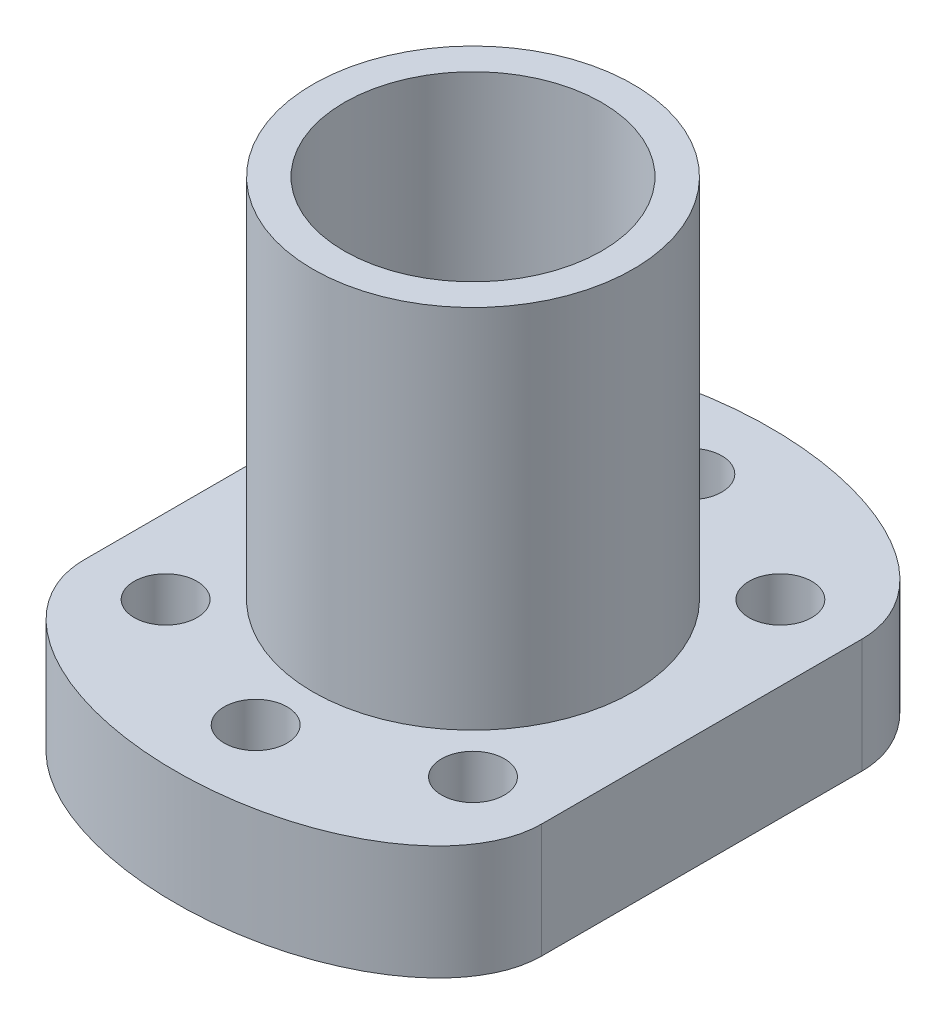
ISO-10303-21;
HEADER;
FILE_DESCRIPTION(('STEP AP214'),'2;1');
FILE_NAME('part.step','',(''),(''),'','','');
FILE_SCHEMA(('AUTOMOTIVE_DESIGN { 1 0 10303 214 1 1 1 1 }'));
ENDSEC;
DATA;
#1=APPLICATION_CONTEXT('core data for automotive mechanical design processes');
#2=APPLICATION_PROTOCOL_DEFINITION('international standard','automotive_design',2000,#1);
#3=PRODUCT_CONTEXT('',#1,'mechanical');
#4=PRODUCT('Part','Part','',(#3));
#5=PRODUCT_RELATED_PRODUCT_CATEGORY('part','',(#4));
#6=PRODUCT_DEFINITION_FORMATION('','',#4);
#7=PRODUCT_DEFINITION_CONTEXT('part definition',#1,'design');
#8=PRODUCT_DEFINITION('design','',#6,#7);
#9=PRODUCT_DEFINITION_SHAPE('','',#8);
#10=(LENGTH_UNIT() NAMED_UNIT(*) SI_UNIT(.MILLI.,.METRE.));
#11=(NAMED_UNIT(*) PLANE_ANGLE_UNIT() SI_UNIT($,.RADIAN.));
#12=(NAMED_UNIT(*) SI_UNIT($,.STERADIAN.) SOLID_ANGLE_UNIT());
#13=UNCERTAINTY_MEASURE_WITH_UNIT(LENGTH_MEASURE(1.E-05),#10,'distance_accuracy_value','');
#14=(GEOMETRIC_REPRESENTATION_CONTEXT(3) GLOBAL_UNCERTAINTY_ASSIGNED_CONTEXT((#13)) GLOBAL_UNIT_ASSIGNED_CONTEXT((#10,
#11,#12)) REPRESENTATION_CONTEXT('',''));
#15=CARTESIAN_POINT('',(0.,0.,0.));
#16=DIRECTION('',(0.,0.,1.));
#17=DIRECTION('',(1.,0.,0.));
#18=AXIS2_PLACEMENT_3D('',#15,#16,#17);
#19=CARTESIAN_POINT('',(0.,10.,-40.));
#20=DIRECTION('',(1.,0.,0.));
#21=DIRECTION('',(0.,0.,-1.));
#22=AXIS2_PLACEMENT_3D('',#19,#20,#21);
#23=PLANE('',#22);
#24=DIRECTION('',(0.,0.,1.));
#25=VECTOR('',#24,1.);
#26=CARTESIAN_POINT('',(0.,0.,-40.));
#27=LINE('',#26,#25);
#28=CARTESIAN_POINT('',(0.,0.,-40.));
#29=VERTEX_POINT('',#28);
#30=CARTESIAN_POINT('',(0.,0.,-12.));
#31=VERTEX_POINT('',#30);
#32=EDGE_CURVE('E117',#29,#31,#27,.T.);
#33=ORIENTED_EDGE('',*,*,#32,.T.);
#34=DIRECTION('',(0.,-1.,0.));
#35=VECTOR('',#34,1.);
#36=CARTESIAN_POINT('',(0.,10.,-12.));
#37=LINE('',#36,#35);
#38=CARTESIAN_POINT('',(0.,10.,-12.));
#39=VERTEX_POINT('',#38);
#40=EDGE_CURVE('E47',#39,#31,#37,.T.);
#41=ORIENTED_EDGE('',*,*,#40,.F.);
#42=DIRECTION('',(0.,0.,1.));
#43=VECTOR('',#42,1.);
#44=CARTESIAN_POINT('',(0.,10.,-40.));
#45=LINE('',#44,#43);
#46=CARTESIAN_POINT('',(0.,10.,-40.));
#47=VERTEX_POINT('',#46);
#48=EDGE_CURVE('E87',#47,#39,#45,.T.);
#49=ORIENTED_EDGE('',*,*,#48,.F.);
#50=DIRECTION('',(0.,-1.,0.));
#51=VECTOR('',#50,1.);
#52=CARTESIAN_POINT('',(0.,10.,-40.));
#53=LINE('',#52,#51);
#54=EDGE_CURVE('E62',#47,#29,#53,.T.);
#55=ORIENTED_EDGE('',*,*,#54,.T.);
#56=EDGE_LOOP('',(#33,#41,#49,#55));
#57=FACE_BOUND('',#56,.T.);
#58=ADVANCED_FACE('F44',(#57),#23,.F.);
#59=CARTESIAN_POINT('',(20.,10.,-12.));
#60=DIRECTION('',(0.,-1.,0.));
#61=DIRECTION('',(1.,0.,0.));
#62=AXIS2_PLACEMENT_3D('',#59,#60,#61);
#63=ELLIPSE('',#62,20.,12.);
#64=DIRECTION('',(0.,-1.,0.));
#65=VECTOR('',#64,1.);
#66=SURFACE_OF_LINEAR_EXTRUSION('',#63,#65);
#67=CARTESIAN_POINT('',(20.,0.,-12.));
#68=DIRECTION('',(0.,-1.,0.));
#69=DIRECTION('',(1.,0.,0.));
#70=AXIS2_PLACEMENT_3D('',#67,#68,#69);
#71=ELLIPSE('',#70,20.,12.);
#72=CARTESIAN_POINT('',(40.,0.,-12.));
#73=VERTEX_POINT('',#72);
#74=EDGE_CURVE('E97',#73,#31,#71,.T.);
#75=ORIENTED_EDGE('',*,*,#74,.F.);
#76=DIRECTION('',(0.,-1.,0.));
#77=VECTOR('',#76,1.);
#78=CARTESIAN_POINT('',(40.,10.,-12.));
#79=LINE('',#78,#77);
#80=CARTESIAN_POINT('',(40.,10.,-12.));
#81=VERTEX_POINT('',#80);
#82=EDGE_CURVE('E93',#81,#73,#79,.T.);
#83=ORIENTED_EDGE('',*,*,#82,.F.);
#84=EDGE_CURVE('E95',#81,#39,#63,.T.);
#85=ORIENTED_EDGE('',*,*,#84,.T.);
#86=ORIENTED_EDGE('',*,*,#40,.T.);
#87=EDGE_LOOP('',(#75,#83,#85,#86));
#88=FACE_BOUND('',#87,.T.);
#89=ADVANCED_FACE('F94',(#88),#66,.T.);
#90=CARTESIAN_POINT('',(40.,10.,-40.));
#91=DIRECTION('',(1.,0.,0.));
#92=DIRECTION('',(0.,0.,-1.));
#93=AXIS2_PLACEMENT_3D('',#90,#91,#92);
#94=PLANE('',#93);
#95=DIRECTION('',(0.,0.,1.));
#96=VECTOR('',#95,1.);
#97=CARTESIAN_POINT('',(40.,0.,-40.));
#98=LINE('',#97,#96);
#99=CARTESIAN_POINT('',(40.,0.,-40.));
#100=VERTEX_POINT('',#99);
#101=EDGE_CURVE('E137',#100,#73,#98,.T.);
#102=ORIENTED_EDGE('',*,*,#101,.F.);
#103=DIRECTION('',(0.,-1.,0.));
#104=VECTOR('',#103,1.);
#105=CARTESIAN_POINT('',(40.,10.,-40.));
#106=LINE('',#105,#104);
#107=CARTESIAN_POINT('',(40.,10.,-40.));
#108=VERTEX_POINT('',#107);
#109=EDGE_CURVE('E76',#108,#100,#106,.T.);
#110=ORIENTED_EDGE('',*,*,#109,.F.);
#111=DIRECTION('',(0.,0.,1.));
#112=VECTOR('',#111,1.);
#113=CARTESIAN_POINT('',(40.,10.,-40.));
#114=LINE('',#113,#112);
#115=EDGE_CURVE('E104',#108,#81,#114,.T.);
#116=ORIENTED_EDGE('',*,*,#115,.T.);
#117=ORIENTED_EDGE('',*,*,#82,.T.);
#118=EDGE_LOOP('',(#102,#110,#116,#117));
#119=FACE_BOUND('',#118,.T.);
#120=ADVANCED_FACE('F107',(#119),#94,.T.);
#121=CARTESIAN_POINT('',(20.,10.,-40.));
#122=DIRECTION('',(0.,-1.,0.));
#123=DIRECTION('',(-1.,0.,0.));
#124=AXIS2_PLACEMENT_3D('',#121,#122,#123);
#125=ELLIPSE('',#124,20.,12.);
#126=DIRECTION('',(0.,-1.,0.));
#127=VECTOR('',#126,1.);
#128=SURFACE_OF_LINEAR_EXTRUSION('',#125,#127);
#129=CARTESIAN_POINT('',(20.,0.,-40.));
#130=DIRECTION('',(0.,-1.,0.));
#131=DIRECTION('',(-1.,0.,0.));
#132=AXIS2_PLACEMENT_3D('',#129,#130,#131);
#133=ELLIPSE('',#132,20.,12.);
#134=EDGE_CURVE('E140',#29,#100,#133,.T.);
#135=ORIENTED_EDGE('',*,*,#134,.F.);
#136=ORIENTED_EDGE('',*,*,#54,.F.);
#137=EDGE_CURVE('E109',#47,#108,#125,.T.);
#138=ORIENTED_EDGE('',*,*,#137,.T.);
#139=ORIENTED_EDGE('',*,*,#109,.T.);
#140=EDGE_LOOP('',(#135,#136,#138,#139));
#141=FACE_BOUND('',#140,.T.);
#142=ADVANCED_FACE('F120',(#141),#128,.T.);
#143=CARTESIAN_POINT('',(20.,10.,-12.));
#144=DIRECTION('',(0.,-1.,0.));
#145=DIRECTION('',(0.,0.,-1.));
#146=AXIS2_PLACEMENT_3D('',#143,#144,#145);
#147=PLANE('',#146);
#148=CARTESIAN_POINT('',(20.,10.,-45.));
#149=DIRECTION('',(0.,1.,0.));
#150=DIRECTION('',(0.,0.,1.));
#151=AXIS2_PLACEMENT_3D('',#148,#149,#150);
#152=CIRCLE('',#151,2.75);
#153=CARTESIAN_POINT('',(20.,10.,-42.25));
#154=VERTEX_POINT('',#153);
#155=EDGE_CURVE('E196',#154,#154,#152,.T.);
#156=ORIENTED_EDGE('',*,*,#155,.F.);
#157=EDGE_LOOP('',(#156));
#158=FACE_BOUND('',#157,.T.);
#159=CARTESIAN_POINT('',(6.56497115745578,10.,-12.5649711574556));
#160=DIRECTION('',(0.,1.,0.));
#161=DIRECTION('',(0.,0.,1.));
#162=AXIS2_PLACEMENT_3D('',#159,#160,#161);
#163=CIRCLE('',#162,2.75);
#164=CARTESIAN_POINT('',(6.56497115745578,10.,-9.81497115745562));
#165=VERTEX_POINT('',#164);
#166=EDGE_CURVE('E168',#165,#165,#163,.T.);
#167=ORIENTED_EDGE('',*,*,#166,.F.);
#168=EDGE_LOOP('',(#167));
#169=FACE_BOUND('',#168,.T.);
#170=CARTESIAN_POINT('',(33.4350288425424,10.,-12.5649711574534));
#171=DIRECTION('',(0.,1.,0.));
#172=DIRECTION('',(0.,0.,1.));
#173=AXIS2_PLACEMENT_3D('',#170,#171,#172);
#174=CIRCLE('',#173,2.75);
#175=CARTESIAN_POINT('',(33.4350288425424,10.,-9.81497115745337));
#176=VERTEX_POINT('',#175);
#177=EDGE_CURVE('E167',#176,#176,#174,.T.);
#178=ORIENTED_EDGE('',*,*,#177,.F.);
#179=EDGE_LOOP('',(#178));
#180=FACE_BOUND('',#179,.T.);
#181=CARTESIAN_POINT('',(20.0000000000002,10.,-7.0000000000002));
#182=DIRECTION('',(0.,1.,0.));
#183=DIRECTION('',(0.,0.,1.));
#184=AXIS2_PLACEMENT_3D('',#181,#182,#183);
#185=CIRCLE('',#184,2.75);
#186=CARTESIAN_POINT('',(20.0000000000002,10.,-4.25000000000021));
#187=VERTEX_POINT('',#186);
#188=EDGE_CURVE('E176',#187,#187,#185,.T.);
#189=ORIENTED_EDGE('',*,*,#188,.F.);
#190=EDGE_LOOP('',(#189));
#191=FACE_BOUND('',#190,.T.);
#192=CARTESIAN_POINT('',(6.56497115745392,10.,-39.4350288425422));
#193=DIRECTION('',(0.,1.,0.));
#194=DIRECTION('',(0.,0.,1.));
#195=AXIS2_PLACEMENT_3D('',#192,#193,#194);
#196=CIRCLE('',#195,2.75);
#197=CARTESIAN_POINT('',(6.56497115745392,10.,-36.6850288425422));
#198=VERTEX_POINT('',#197);
#199=EDGE_CURVE('E184',#198,#198,#196,.T.);
#200=ORIENTED_EDGE('',*,*,#199,.F.);
#201=EDGE_LOOP('',(#200));
#202=FACE_BOUND('',#201,.T.);
#203=CARTESIAN_POINT('',(33.4350288425445,10.,-39.4350288425445));
#204=DIRECTION('',(0.,1.,0.));
#205=DIRECTION('',(0.,0.,1.));
#206=AXIS2_PLACEMENT_3D('',#203,#204,#205);
#207=CIRCLE('',#206,2.75);
#208=CARTESIAN_POINT('',(33.4350288425445,10.,-36.6850288425445));
#209=VERTEX_POINT('',#208);
#210=EDGE_CURVE('E192',#209,#209,#207,.T.);
#211=ORIENTED_EDGE('',*,*,#210,.F.);
#212=EDGE_LOOP('',(#211));
#213=FACE_BOUND('',#212,.T.);
#214=CARTESIAN_POINT('',(20.,10.,-26.));
#215=DIRECTION('',(0.,1.,0.));
#216=DIRECTION('',(0.,0.,1.));
#217=AXIS2_PLACEMENT_3D('',#214,#215,#216);
#218=CIRCLE('',#217,14.);
#219=CARTESIAN_POINT('',(20.,10.,-12.));
#220=VERTEX_POINT('',#219);
#221=EDGE_CURVE('E11',#220,#220,#218,.T.);
#222=ORIENTED_EDGE('',*,*,#221,.F.);
#223=EDGE_LOOP('',(#222));
#224=FACE_BOUND('',#223,.T.);
#225=ORIENTED_EDGE('',*,*,#48,.T.);
#226=ORIENTED_EDGE('',*,*,#84,.F.);
#227=ORIENTED_EDGE('',*,*,#115,.F.);
#228=ORIENTED_EDGE('',*,*,#137,.F.);
#229=EDGE_LOOP('',(#225,#226,#227,#228));
#230=FACE_BOUND('',#229,.T.);
#231=ADVANCED_FACE('F103',(#158,#169,#180,#191,#202,#213,#224,#230),#147,.F.);
#232=CARTESIAN_POINT('',(20.,0.,-12.));
#233=DIRECTION('',(0.,-1.,0.));
#234=DIRECTION('',(0.,0.,-1.));
#235=AXIS2_PLACEMENT_3D('',#232,#233,#234);
#236=PLANE('',#235);
#237=CARTESIAN_POINT('',(20.,0.,-45.));
#238=DIRECTION('',(0.,1.,0.));
#239=DIRECTION('',(0.,0.,1.));
#240=AXIS2_PLACEMENT_3D('',#237,#238,#239);
#241=CIRCLE('',#240,2.75);
#242=CARTESIAN_POINT('',(20.,0.,-42.25));
#243=VERTEX_POINT('',#242);
#244=EDGE_CURVE('E159',#243,#243,#241,.T.);
#245=ORIENTED_EDGE('',*,*,#244,.T.);
#246=EDGE_LOOP('',(#245));
#247=FACE_BOUND('',#246,.T.);
#248=CARTESIAN_POINT('',(6.56497115745578,0.,-12.5649711574556));
#249=DIRECTION('',(0.,1.,0.));
#250=DIRECTION('',(0.,0.,1.));
#251=AXIS2_PLACEMENT_3D('',#248,#249,#250);
#252=CIRCLE('',#251,2.75);
#253=CARTESIAN_POINT('',(6.56497115745578,0.,-9.81497115745562));
#254=VERTEX_POINT('',#253);
#255=EDGE_CURVE('E197',#254,#254,#252,.T.);
#256=ORIENTED_EDGE('',*,*,#255,.T.);
#257=EDGE_LOOP('',(#256));
#258=FACE_BOUND('',#257,.T.);
#259=CARTESIAN_POINT('',(33.4350288425424,0.,-12.5649711574534));
#260=DIRECTION('',(0.,1.,0.));
#261=DIRECTION('',(0.,0.,1.));
#262=AXIS2_PLACEMENT_3D('',#259,#260,#261);
#263=CIRCLE('',#262,2.75);
#264=CARTESIAN_POINT('',(33.4350288425424,0.,-9.81497115745337));
#265=VERTEX_POINT('',#264);
#266=EDGE_CURVE('E163',#265,#265,#263,.T.);
#267=ORIENTED_EDGE('',*,*,#266,.T.);
#268=EDGE_LOOP('',(#267));
#269=FACE_BOUND('',#268,.T.);
#270=CARTESIAN_POINT('',(20.0000000000002,0.,-7.0000000000002));
#271=DIRECTION('',(0.,1.,0.));
#272=DIRECTION('',(0.,0.,1.));
#273=AXIS2_PLACEMENT_3D('',#270,#271,#272);
#274=CIRCLE('',#273,2.75);
#275=CARTESIAN_POINT('',(20.0000000000002,0.,-4.25000000000021));
#276=VERTEX_POINT('',#275);
#277=EDGE_CURVE('E172',#276,#276,#274,.T.);
#278=ORIENTED_EDGE('',*,*,#277,.T.);
#279=EDGE_LOOP('',(#278));
#280=FACE_BOUND('',#279,.T.);
#281=CARTESIAN_POINT('',(6.56497115745392,0.,-39.4350288425422));
#282=DIRECTION('',(0.,1.,0.));
#283=DIRECTION('',(0.,0.,1.));
#284=AXIS2_PLACEMENT_3D('',#281,#282,#283);
#285=CIRCLE('',#284,2.75);
#286=CARTESIAN_POINT('',(6.56497115745392,0.,-36.6850288425422));
#287=VERTEX_POINT('',#286);
#288=EDGE_CURVE('E180',#287,#287,#285,.T.);
#289=ORIENTED_EDGE('',*,*,#288,.T.);
#290=EDGE_LOOP('',(#289));
#291=FACE_BOUND('',#290,.T.);
#292=CARTESIAN_POINT('',(33.4350288425445,0.,-39.4350288425445));
#293=DIRECTION('',(0.,1.,0.));
#294=DIRECTION('',(0.,0.,1.));
#295=AXIS2_PLACEMENT_3D('',#292,#293,#294);
#296=CIRCLE('',#295,2.75);
#297=CARTESIAN_POINT('',(33.4350288425445,0.,-36.6850288425445));
#298=VERTEX_POINT('',#297);
#299=EDGE_CURVE('E188',#298,#298,#296,.T.);
#300=ORIENTED_EDGE('',*,*,#299,.T.);
#301=EDGE_LOOP('',(#300));
#302=FACE_BOUND('',#301,.T.);
#303=CARTESIAN_POINT('',(20.,0.,-26.));
#304=DIRECTION('',(0.,1.,0.));
#305=DIRECTION('',(0.,0.,1.));
#306=AXIS2_PLACEMENT_3D('',#303,#304,#305);
#307=CIRCLE('',#306,11.25);
#308=CARTESIAN_POINT('',(20.,0.,-14.75));
#309=VERTEX_POINT('',#308);
#310=EDGE_CURVE('E154',#309,#309,#307,.T.);
#311=ORIENTED_EDGE('',*,*,#310,.T.);
#312=EDGE_LOOP('',(#311));
#313=FACE_BOUND('',#312,.T.);
#314=ORIENTED_EDGE('',*,*,#32,.F.);
#315=ORIENTED_EDGE('',*,*,#134,.T.);
#316=ORIENTED_EDGE('',*,*,#101,.T.);
#317=ORIENTED_EDGE('',*,*,#74,.T.);
#318=EDGE_LOOP('',(#314,#315,#316,#317));
#319=FACE_BOUND('',#318,.T.);
#320=ADVANCED_FACE('F124',(#247,#258,#269,#280,#291,#302,#313,#319),#236,.T.);
#321=CARTESIAN_POINT('',(20.,42.,-26.));
#322=DIRECTION('',(0.,-1.,0.));
#323=DIRECTION('',(0.,0.,-1.));
#324=AXIS2_PLACEMENT_3D('',#321,#322,#323);
#325=CYLINDRICAL_SURFACE('',#324,14.);
#326=CARTESIAN_POINT('',(20.,42.,-26.));
#327=DIRECTION('',(0.,1.,0.));
#328=DIRECTION('',(0.,0.,1.));
#329=AXIS2_PLACEMENT_3D('',#326,#327,#328);
#330=CIRCLE('',#329,14.);
#331=CARTESIAN_POINT('',(20.,42.,-12.));
#332=VERTEX_POINT('',#331);
#333=EDGE_CURVE('E136',#332,#332,#330,.T.);
#334=ORIENTED_EDGE('',*,*,#333,.F.);
#335=EDGE_LOOP('',(#334));
#336=FACE_BOUND('',#335,.T.);
#337=ORIENTED_EDGE('',*,*,#221,.T.);
#338=EDGE_LOOP('',(#337));
#339=FACE_BOUND('',#338,.T.);
#340=ADVANCED_FACE('F234',(#336,#339),#325,.T.);
#341=CARTESIAN_POINT('',(20.,42.,-26.));
#342=DIRECTION('',(0.,1.,0.));
#343=DIRECTION('',(0.,0.,1.));
#344=AXIS2_PLACEMENT_3D('',#341,#342,#343);
#345=PLANE('',#344);
#346=CARTESIAN_POINT('',(20.,42.,-26.));
#347=DIRECTION('',(0.,1.,0.));
#348=DIRECTION('',(0.,0.,1.));
#349=AXIS2_PLACEMENT_3D('',#346,#347,#348);
#350=CIRCLE('',#349,11.25);
#351=CARTESIAN_POINT('',(20.,42.,-14.75));
#352=VERTEX_POINT('',#351);
#353=EDGE_CURVE('E155',#352,#352,#350,.T.);
#354=ORIENTED_EDGE('',*,*,#353,.F.);
#355=EDGE_LOOP('',(#354));
#356=FACE_BOUND('',#355,.T.);
#357=ORIENTED_EDGE('',*,*,#333,.T.);
#358=EDGE_LOOP('',(#357));
#359=FACE_BOUND('',#358,.T.);
#360=ADVANCED_FACE('F236',(#356,#359),#345,.T.);
#361=CARTESIAN_POINT('',(20.,0.,-26.));
#362=DIRECTION('',(0.,1.,0.));
#363=DIRECTION('',(0.,0.,1.));
#364=AXIS2_PLACEMENT_3D('',#361,#362,#363);
#365=CYLINDRICAL_SURFACE('',#364,11.25);
#366=CARTESIAN_POINT('',(20.,0.,-14.75));
#367=CARTESIAN_POINT('',(20.,0.437499999999999,-14.75));
#368=CARTESIAN_POINT('',(20.,0.875,-14.75));
#369=CARTESIAN_POINT('',(20.,1.75,-14.75));
#370=CARTESIAN_POINT('',(20.,2.1875,-14.75));
#371=CARTESIAN_POINT('',(20.,3.0625,-14.75));
#372=CARTESIAN_POINT('',(20.,3.5,-14.75));
#373=CARTESIAN_POINT('',(20.,4.375,-14.75));
#374=CARTESIAN_POINT('',(20.,4.8125,-14.75));
#375=CARTESIAN_POINT('',(20.,5.6875,-14.75));
#376=CARTESIAN_POINT('',(20.,6.125,-14.75));
#377=CARTESIAN_POINT('',(20.,7.,-14.75));
#378=CARTESIAN_POINT('',(20.,7.4375,-14.75));
#379=CARTESIAN_POINT('',(20.,8.3125,-14.75));
#380=CARTESIAN_POINT('',(20.,8.75,-14.75));
#381=CARTESIAN_POINT('',(20.,9.625,-14.75));
#382=CARTESIAN_POINT('',(20.,10.0625,-14.75));
#383=CARTESIAN_POINT('',(20.,10.9375,-14.75));
#384=CARTESIAN_POINT('',(20.,11.375,-14.75));
#385=CARTESIAN_POINT('',(20.,12.25,-14.75));
#386=CARTESIAN_POINT('',(20.,12.6875,-14.75));
#387=CARTESIAN_POINT('',(20.,13.5625,-14.75));
#388=CARTESIAN_POINT('',(20.,14.,-14.75));
#389=CARTESIAN_POINT('',(20.,14.875,-14.75));
#390=CARTESIAN_POINT('',(20.,15.3125,-14.75));
#391=CARTESIAN_POINT('',(20.,16.1875,-14.75));
#392=CARTESIAN_POINT('',(20.,16.625,-14.75));
#393=CARTESIAN_POINT('',(20.,17.5,-14.75));
#394=CARTESIAN_POINT('',(20.,17.9375,-14.75));
#395=CARTESIAN_POINT('',(20.,18.8125,-14.75));
#396=CARTESIAN_POINT('',(20.,19.25,-14.75));
#397=CARTESIAN_POINT('',(20.,20.125,-14.75));
#398=CARTESIAN_POINT('',(20.,20.5625,-14.75));
#399=CARTESIAN_POINT('',(20.,21.4375,-14.75));
#400=CARTESIAN_POINT('',(20.,21.875,-14.75));
#401=CARTESIAN_POINT('',(20.,22.75,-14.75));
#402=CARTESIAN_POINT('',(20.,23.1875,-14.75));
#403=CARTESIAN_POINT('',(20.,24.0625,-14.75));
#404=CARTESIAN_POINT('',(20.,24.5,-14.75));
#405=CARTESIAN_POINT('',(20.,25.375,-14.75));
#406=CARTESIAN_POINT('',(20.,25.8125,-14.75));
#407=CARTESIAN_POINT('',(20.,26.6875,-14.75));
#408=CARTESIAN_POINT('',(20.,27.125,-14.75));
#409=CARTESIAN_POINT('',(20.,28.,-14.75));
#410=CARTESIAN_POINT('',(20.,28.4375,-14.75));
#411=CARTESIAN_POINT('',(20.,29.3125,-14.75));
#412=CARTESIAN_POINT('',(20.,29.75,-14.75));
#413=CARTESIAN_POINT('',(20.,30.625,-14.75));
#414=CARTESIAN_POINT('',(20.,31.0625,-14.75));
#415=CARTESIAN_POINT('',(20.,31.9375,-14.75));
#416=CARTESIAN_POINT('',(20.,32.375,-14.75));
#417=CARTESIAN_POINT('',(20.,33.25,-14.75));
#418=CARTESIAN_POINT('',(20.,33.6875,-14.75));
#419=CARTESIAN_POINT('',(20.,34.5625,-14.75));
#420=CARTESIAN_POINT('',(20.,35.,-14.75));
#421=CARTESIAN_POINT('',(20.,35.875,-14.75));
#422=CARTESIAN_POINT('',(20.,36.3125,-14.75));
#423=CARTESIAN_POINT('',(20.,37.1875,-14.75));
#424=CARTESIAN_POINT('',(20.,37.625,-14.75));
#425=CARTESIAN_POINT('',(20.,38.5,-14.75));
#426=CARTESIAN_POINT('',(20.,38.9375,-14.75));
#427=CARTESIAN_POINT('',(20.,39.8125,-14.75));
#428=CARTESIAN_POINT('',(20.,40.25,-14.75));
#429=CARTESIAN_POINT('',(20.,41.125,-14.75));
#430=CARTESIAN_POINT('',(20.,41.5625,-14.75));
#431=CARTESIAN_POINT('',(20.,42.,-14.75));
#432=B_SPLINE_CURVE_WITH_KNOTS('',3,(#366,#367,#368,#369,#370,#371,#372,#373,#374,#375,#376,
#377,#378,#379,#380,#381,#382,#383,#384,#385,#386,#387,#388,#389,#390,#391,#392,#393,#394,#395,
#396,#397,#398,#399,#400,#401,#402,#403,#404,#405,#406,#407,#408,#409,#410,#411,#412,#413,#414,
#415,#416,#417,#418,#419,#420,#421,#422,#423,#424,#425,#426,#427,#428,#429,#430,#431),
.UNSPECIFIED.,.F.,.F.,(4,2,2,2,2,2,2,2,2,2,2,2,2,2,2,2,2,2,2,2,2,2,2,2,2,2,2,2,2,2,2,2,4),(0.,
1.3125,2.625,3.9375,5.25,6.5625,7.875,9.1875,10.5,11.8125,13.125,14.4375,15.75,17.0625,18.375,
19.6875,21.,22.3125,23.625,24.9375,26.25,27.5625,28.875,30.1875,31.5,32.8125,34.125,35.4375,
36.75,38.0625,39.375,40.6875,42.),.UNSPECIFIED.);
#433=EDGE_CURVE('BSEAM242',#309,#352,#432,.T.);
#434=ORIENTED_EDGE('',*,*,#310,.F.);
#435=ORIENTED_EDGE('',*,*,#353,.T.);
#436=ORIENTED_EDGE('',*,*,#433,.T.);
#437=ORIENTED_EDGE('',*,*,#433,.F.);
#438=EDGE_LOOP('',(#434,#436,#435,#437));
#439=FACE_BOUND('',#438,.T.);
#440=ADVANCED_FACE('F242',(#439),#365,.F.);
#441=CARTESIAN_POINT('',(33.4350288425445,0.,-39.4350288425445));
#442=DIRECTION('',(0.,1.,0.));
#443=DIRECTION('',(0.,0.,1.));
#444=AXIS2_PLACEMENT_3D('',#441,#442,#443);
#445=CYLINDRICAL_SURFACE('',#444,2.75);
#446=ORIENTED_EDGE('',*,*,#299,.F.);
#447=EDGE_LOOP('',(#446));
#448=FACE_BOUND('',#447,.T.);
#449=ORIENTED_EDGE('',*,*,#210,.T.);
#450=EDGE_LOOP('',(#449));
#451=FACE_BOUND('',#450,.T.);
#452=ADVANCED_FACE('F250',(#448,#451),#445,.F.);
#453=CARTESIAN_POINT('',(6.56497115745392,0.,-39.4350288425422));
#454=DIRECTION('',(0.,1.,0.));
#455=DIRECTION('',(0.,0.,1.));
#456=AXIS2_PLACEMENT_3D('',#453,#454,#455);
#457=CYLINDRICAL_SURFACE('',#456,2.75);
#458=ORIENTED_EDGE('',*,*,#288,.F.);
#459=EDGE_LOOP('',(#458));
#460=FACE_BOUND('',#459,.T.);
#461=ORIENTED_EDGE('',*,*,#199,.T.);
#462=EDGE_LOOP('',(#461));
#463=FACE_BOUND('',#462,.T.);
#464=ADVANCED_FACE('F259',(#460,#463),#457,.F.);
#465=CARTESIAN_POINT('',(20.0000000000002,0.,-7.0000000000002));
#466=DIRECTION('',(0.,1.,0.));
#467=DIRECTION('',(0.,0.,1.));
#468=AXIS2_PLACEMENT_3D('',#465,#466,#467);
#469=CYLINDRICAL_SURFACE('',#468,2.75);
#470=ORIENTED_EDGE('',*,*,#277,.F.);
#471=EDGE_LOOP('',(#470));
#472=FACE_BOUND('',#471,.T.);
#473=ORIENTED_EDGE('',*,*,#188,.T.);
#474=EDGE_LOOP('',(#473));
#475=FACE_BOUND('',#474,.T.);
#476=ADVANCED_FACE('F255',(#472,#475),#469,.F.);
#477=CARTESIAN_POINT('',(33.4350288425424,0.,-12.5649711574534));
#478=DIRECTION('',(0.,1.,0.));
#479=DIRECTION('',(0.,0.,1.));
#480=AXIS2_PLACEMENT_3D('',#477,#478,#479);
#481=CYLINDRICAL_SURFACE('',#480,2.75);
#482=ORIENTED_EDGE('',*,*,#266,.F.);
#483=EDGE_LOOP('',(#482));
#484=FACE_BOUND('',#483,.T.);
#485=ORIENTED_EDGE('',*,*,#177,.T.);
#486=EDGE_LOOP('',(#485));
#487=FACE_BOUND('',#486,.T.);
#488=ADVANCED_FACE('F252',(#484,#487),#481,.F.);
#489=CARTESIAN_POINT('',(6.56497115745578,0.,-12.5649711574556));
#490=DIRECTION('',(0.,1.,0.));
#491=DIRECTION('',(0.,0.,1.));
#492=AXIS2_PLACEMENT_3D('',#489,#490,#491);
#493=CYLINDRICAL_SURFACE('',#492,2.75);
#494=ORIENTED_EDGE('',*,*,#255,.F.);
#495=EDGE_LOOP('',(#494));
#496=FACE_BOUND('',#495,.T.);
#497=ORIENTED_EDGE('',*,*,#166,.T.);
#498=EDGE_LOOP('',(#497));
#499=FACE_BOUND('',#498,.T.);
#500=ADVANCED_FACE('F216',(#496,#499),#493,.F.);
#501=CARTESIAN_POINT('',(20.,0.,-45.));
#502=DIRECTION('',(0.,1.,0.));
#503=DIRECTION('',(0.,0.,1.));
#504=AXIS2_PLACEMENT_3D('',#501,#502,#503);
#505=CYLINDRICAL_SURFACE('',#504,2.75);
#506=ORIENTED_EDGE('',*,*,#244,.F.);
#507=EDGE_LOOP('',(#506));
#508=FACE_BOUND('',#507,.T.);
#509=ORIENTED_EDGE('',*,*,#155,.T.);
#510=EDGE_LOOP('',(#509));
#511=FACE_BOUND('',#510,.T.);
#512=ADVANCED_FACE('F213',(#508,#511),#505,.F.);
#513=CLOSED_SHELL('',(#58,#89,#120,#142,#231,#320,#340,#360,#440,#452,#464,#476,#488,#500,#512));
#514=MANIFOLD_SOLID_BREP('B2',#513);
#515=ADVANCED_BREP_SHAPE_REPRESENTATION('',(#18,#514),#14);
#516=SHAPE_DEFINITION_REPRESENTATION(#9,#515);
ENDSEC;
END-ISO-10303-21;
